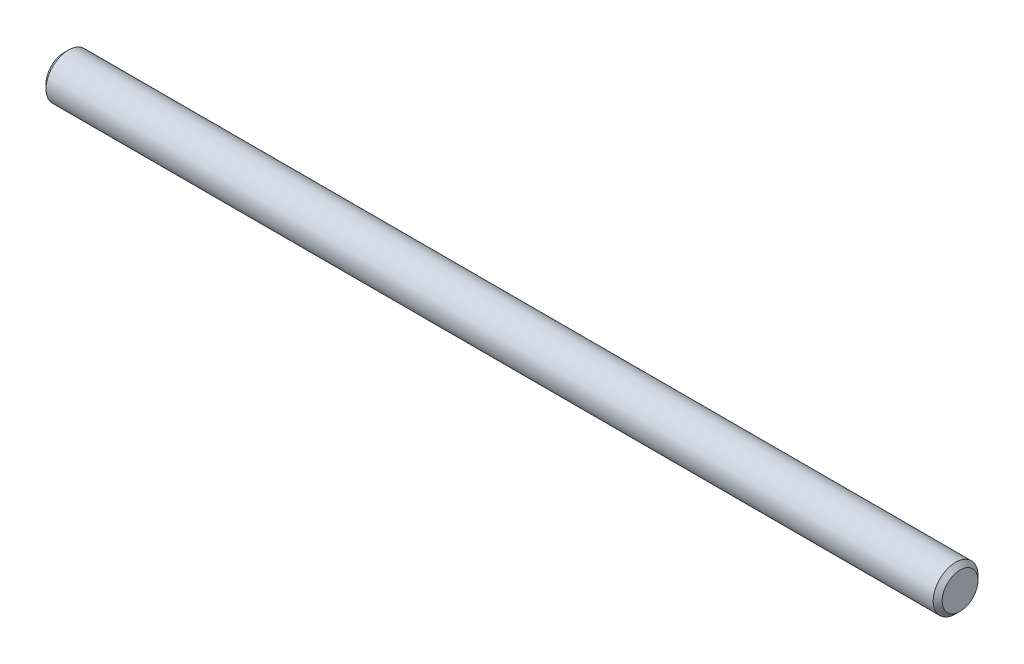
ISO-10303-21;
HEADER;
FILE_DESCRIPTION(('STEP AP214'),'2;1');
FILE_NAME('part.step','',(''),(''),'','','');
FILE_SCHEMA(('AUTOMOTIVE_DESIGN { 1 0 10303 214 1 1 1 1 }'));
ENDSEC;
DATA;
#1=APPLICATION_CONTEXT('core data for automotive mechanical design processes');
#2=APPLICATION_PROTOCOL_DEFINITION('international standard','automotive_design',2000,#1);
#3=PRODUCT_CONTEXT('',#1,'mechanical');
#4=PRODUCT('Part','Part','',(#3));
#5=PRODUCT_RELATED_PRODUCT_CATEGORY('part','',(#4));
#6=PRODUCT_DEFINITION_FORMATION('','',#4);
#7=PRODUCT_DEFINITION_CONTEXT('part definition',#1,'design');
#8=PRODUCT_DEFINITION('design','',#6,#7);
#9=PRODUCT_DEFINITION_SHAPE('','',#8);
#10=(LENGTH_UNIT() NAMED_UNIT(*) SI_UNIT(.MILLI.,.METRE.));
#11=(NAMED_UNIT(*) PLANE_ANGLE_UNIT() SI_UNIT($,.RADIAN.));
#12=(NAMED_UNIT(*) SI_UNIT($,.STERADIAN.) SOLID_ANGLE_UNIT());
#13=UNCERTAINTY_MEASURE_WITH_UNIT(LENGTH_MEASURE(1.E-05),#10,'distance_accuracy_value','');
#14=(GEOMETRIC_REPRESENTATION_CONTEXT(3) GLOBAL_UNCERTAINTY_ASSIGNED_CONTEXT((#13)) GLOBAL_UNIT_ASSIGNED_CONTEXT((#10,
#11,#12)) REPRESENTATION_CONTEXT('',''));
#15=CARTESIAN_POINT('',(0.,0.,0.));
#16=DIRECTION('',(0.,0.,1.));
#17=DIRECTION('',(1.,0.,0.));
#18=AXIS2_PLACEMENT_3D('',#15,#16,#17);
#19=CARTESIAN_POINT('',(-7.9375,0.,0.));
#20=DIRECTION('',(1.,0.,0.));
#21=DIRECTION('',(0.,0.,-1.));
#22=AXIS2_PLACEMENT_3D('',#19,#20,#21);
#23=CYLINDRICAL_SURFACE('',#22,0.396875);
#24=CARTESIAN_POINT('',(7.858125,0.,0.));
#25=DIRECTION('',(1.,0.,0.));
#26=DIRECTION('',(0.,0.,-1.));
#27=AXIS2_PLACEMENT_3D('',#24,#25,#26);
#28=CIRCLE('',#27,0.396875);
#29=CARTESIAN_POINT('',(7.858125,0.,-0.396875));
#30=VERTEX_POINT('',#29);
#31=EDGE_CURVE('E39',#30,#30,#28,.F.);
#32=ORIENTED_EDGE('',*,*,#31,.T.);
#33=EDGE_LOOP('',(#32));
#34=FACE_BOUND('',#33,.T.);
#35=CARTESIAN_POINT('',(-7.858125,0.,0.));
#36=DIRECTION('',(1.,0.,0.));
#37=DIRECTION('',(0.,0.,-1.));
#38=AXIS2_PLACEMENT_3D('',#35,#36,#37);
#39=CIRCLE('',#38,0.396875);
#40=CARTESIAN_POINT('',(-7.858125,0.,-0.396875));
#41=VERTEX_POINT('',#40);
#42=EDGE_CURVE('E43',#41,#41,#39,.T.);
#43=ORIENTED_EDGE('',*,*,#42,.T.);
#44=EDGE_LOOP('',(#43));
#45=FACE_BOUND('',#44,.T.);
#46=ADVANCED_FACE('F32',(#34,#45),#23,.T.);
#47=CARTESIAN_POINT('',(-7.9375,0.,0.));
#48=DIRECTION('',(1.,0.,0.));
#49=DIRECTION('',(0.,0.,-1.));
#50=AXIS2_PLACEMENT_3D('',#47,#48,#49);
#51=PLANE('',#50);
#52=CARTESIAN_POINT('',(-7.9375,0.,0.));
#53=DIRECTION('',(1.,0.,0.));
#54=DIRECTION('',(0.,0.,-1.));
#55=AXIS2_PLACEMENT_3D('',#52,#53,#54);
#56=CIRCLE('',#55,0.317499999999997);
#57=CARTESIAN_POINT('',(-7.9375,0.,-0.317499999999997));
#58=VERTEX_POINT('',#57);
#59=EDGE_CURVE('E10',#58,#58,#56,.F.);
#60=ORIENTED_EDGE('',*,*,#59,.T.);
#61=EDGE_LOOP('',(#60));
#62=FACE_BOUND('',#61,.T.);
#63=ADVANCED_FACE('F63',(#62),#51,.F.);
#64=CARTESIAN_POINT('',(7.9375,0.,0.));
#65=DIRECTION('',(1.,0.,0.));
#66=DIRECTION('',(0.,0.,-1.));
#67=AXIS2_PLACEMENT_3D('',#64,#65,#66);
#68=PLANE('',#67);
#69=CARTESIAN_POINT('',(7.9375,0.,0.));
#70=DIRECTION('',(1.,0.,0.));
#71=DIRECTION('',(0.,0.,-1.));
#72=AXIS2_PLACEMENT_3D('',#69,#70,#71);
#73=CIRCLE('',#72,0.3175);
#74=CARTESIAN_POINT('',(7.9375,0.,-0.3175));
#75=VERTEX_POINT('',#74);
#76=EDGE_CURVE('E47',#75,#75,#73,.T.);
#77=ORIENTED_EDGE('',*,*,#76,.T.);
#78=EDGE_LOOP('',(#77));
#79=FACE_BOUND('',#78,.T.);
#80=ADVANCED_FACE('F53',(#79),#68,.T.);
#81=CARTESIAN_POINT('',(7.9375,0.,0.));
#82=DIRECTION('',(-1.,0.,0.));
#83=DIRECTION('',(0.,0.,1.));
#84=AXIS2_PLACEMENT_3D('',#81,#82,#83);
#85=CONICAL_SURFACE('',#84,0.3175,0.785398163397451);
#86=ORIENTED_EDGE('',*,*,#31,.F.);
#87=EDGE_LOOP('',(#86));
#88=FACE_BOUND('',#87,.T.);
#89=ORIENTED_EDGE('',*,*,#76,.F.);
#90=EDGE_LOOP('',(#89));
#91=FACE_BOUND('',#90,.T.);
#92=ADVANCED_FACE('F55',(#88,#91),#85,.T.);
#93=CARTESIAN_POINT('',(-7.858125,0.,0.));
#94=DIRECTION('',(1.,0.,0.));
#95=DIRECTION('',(0.,0.,-1.));
#96=AXIS2_PLACEMENT_3D('',#93,#94,#95);
#97=CONICAL_SURFACE('',#96,0.396875,0.785398163397451);
#98=ORIENTED_EDGE('',*,*,#59,.F.);
#99=EDGE_LOOP('',(#98));
#100=FACE_BOUND('',#99,.T.);
#101=ORIENTED_EDGE('',*,*,#42,.F.);
#102=EDGE_LOOP('',(#101));
#103=FACE_BOUND('',#102,.T.);
#104=ADVANCED_FACE('F34',(#100,#103),#97,.T.);
#105=CLOSED_SHELL('',(#46,#63,#80,#92,#104));
#106=MANIFOLD_SOLID_BREP('B2',#105);
#107=ADVANCED_BREP_SHAPE_REPRESENTATION('',(#18,#106),#14);
#108=SHAPE_DEFINITION_REPRESENTATION(#9,#107);
ENDSEC;
END-ISO-10303-21;
